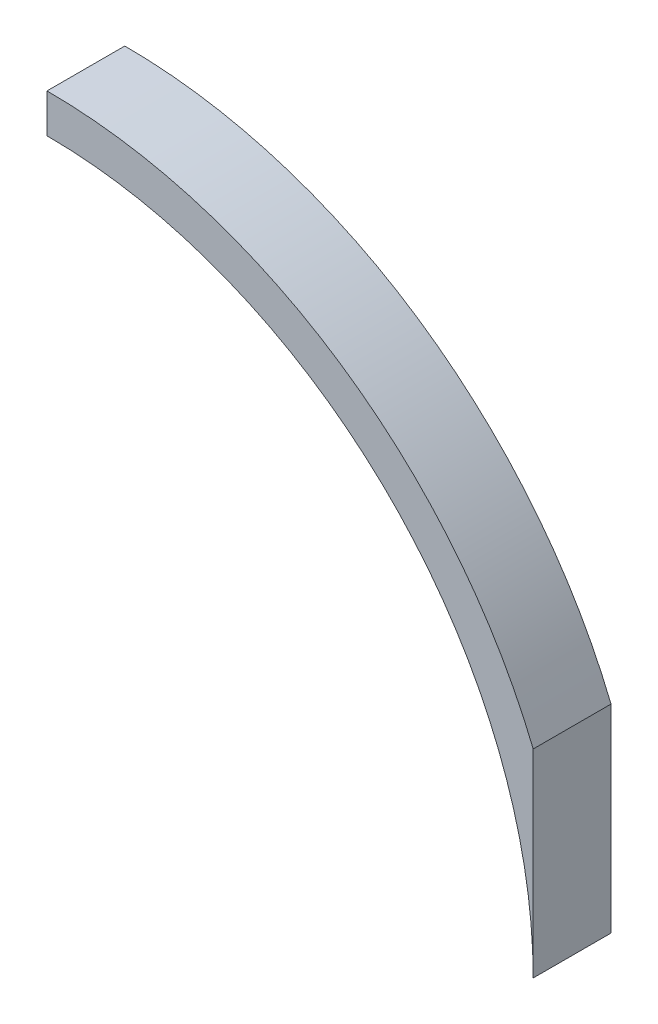
ISO-10303-21;
HEADER;
FILE_DESCRIPTION(('STEP AP214'),'2;1');
FILE_NAME('part.step','',(''),(''),'','','');
FILE_SCHEMA(('AUTOMOTIVE_DESIGN { 1 0 10303 214 1 1 1 1 }'));
ENDSEC;
DATA;
#1=APPLICATION_CONTEXT('core data for automotive mechanical design processes');
#2=APPLICATION_PROTOCOL_DEFINITION('international standard','automotive_design',2000,#1);
#3=PRODUCT_CONTEXT('',#1,'mechanical');
#4=PRODUCT('Part','Part','',(#3));
#5=PRODUCT_RELATED_PRODUCT_CATEGORY('part','',(#4));
#6=PRODUCT_DEFINITION_FORMATION('','',#4);
#7=PRODUCT_DEFINITION_CONTEXT('part definition',#1,'design');
#8=PRODUCT_DEFINITION('design','',#6,#7);
#9=PRODUCT_DEFINITION_SHAPE('','',#8);
#10=(LENGTH_UNIT() NAMED_UNIT(*) SI_UNIT(.MILLI.,.METRE.));
#11=(NAMED_UNIT(*) PLANE_ANGLE_UNIT() SI_UNIT($,.RADIAN.));
#12=(NAMED_UNIT(*) SI_UNIT($,.STERADIAN.) SOLID_ANGLE_UNIT());
#13=UNCERTAINTY_MEASURE_WITH_UNIT(LENGTH_MEASURE(1.E-05),#10,'distance_accuracy_value','');
#14=(GEOMETRIC_REPRESENTATION_CONTEXT(3) GLOBAL_UNCERTAINTY_ASSIGNED_CONTEXT((#13)) GLOBAL_UNIT_ASSIGNED_CONTEXT((#10,
#11,#12)) REPRESENTATION_CONTEXT('',''));
#15=CARTESIAN_POINT('',(0.,0.,0.));
#16=DIRECTION('',(0.,0.,1.));
#17=DIRECTION('',(1.,0.,0.));
#18=AXIS2_PLACEMENT_3D('',#15,#16,#17);
#19=CARTESIAN_POINT('',(0.,0.,20.));
#20=DIRECTION('',(0.,0.,-1.));
#21=DIRECTION('',(-1.,0.,0.));
#22=AXIS2_PLACEMENT_3D('',#19,#20,#21);
#23=CYLINDRICAL_SURFACE('',#22,125.);
#24=CARTESIAN_POINT('',(0.,0.,0.));
#25=DIRECTION('',(0.,0.,-1.));
#26=DIRECTION('',(1.,0.,0.));
#27=AXIS2_PLACEMENT_3D('',#24,#25,#26);
#28=CIRCLE('',#27,125.);
#29=CARTESIAN_POINT('',(3.65615931134792E-13,125.,0.));
#30=VERTEX_POINT('',#29);
#31=CARTESIAN_POINT('',(125.,0.,0.));
#32=VERTEX_POINT('',#31);
#33=EDGE_CURVE('E81',#30,#32,#28,.T.);
#34=ORIENTED_EDGE('',*,*,#33,.T.);
#35=DIRECTION('',(0.,0.,-1.));
#36=VECTOR('',#35,1.);
#37=CARTESIAN_POINT('',(125.,0.,20.));
#38=LINE('',#37,#36);
#39=CARTESIAN_POINT('',(125.,0.,20.));
#40=VERTEX_POINT('',#39);
#41=EDGE_CURVE('E41',#40,#32,#38,.T.);
#42=ORIENTED_EDGE('',*,*,#41,.F.);
#43=CARTESIAN_POINT('',(0.,0.,20.));
#44=DIRECTION('',(0.,0.,-1.));
#45=DIRECTION('',(1.,0.,0.));
#46=AXIS2_PLACEMENT_3D('',#43,#44,#45);
#47=CIRCLE('',#46,125.);
#48=CARTESIAN_POINT('',(3.65615931134792E-13,125.,20.));
#49=VERTEX_POINT('',#48);
#50=EDGE_CURVE('E76',#49,#40,#47,.T.);
#51=ORIENTED_EDGE('',*,*,#50,.F.);
#52=DIRECTION('',(0.,0.,-1.));
#53=VECTOR('',#52,1.);
#54=CARTESIAN_POINT('',(3.65615931134792E-13,125.,20.));
#55=LINE('',#54,#53);
#56=EDGE_CURVE('E71',#49,#30,#55,.T.);
#57=ORIENTED_EDGE('',*,*,#56,.T.);
#58=EDGE_LOOP('',(#34,#42,#51,#57));
#59=FACE_BOUND('',#58,.T.);
#60=ADVANCED_FACE('F33',(#59),#23,.F.);
#61=CARTESIAN_POINT('',(0.,0.,20.));
#62=DIRECTION('',(0.,0.,-1.));
#63=DIRECTION('',(-1.,0.,0.));
#64=AXIS2_PLACEMENT_3D('',#61,#62,#63);
#65=CYLINDRICAL_SURFACE('',#64,135.);
#66=CARTESIAN_POINT('',(0.,0.,20.));
#67=DIRECTION('',(0.,0.,1.));
#68=DIRECTION('',(1.,0.,0.));
#69=AXIS2_PLACEMENT_3D('',#66,#67,#68);
#70=CIRCLE('',#69,135.);
#71=CARTESIAN_POINT('',(125.,50.9901951359279,20.));
#72=VERTEX_POINT('',#71);
#73=CARTESIAN_POINT('',(3.97954647537675E-13,135.,20.));
#74=VERTEX_POINT('',#73);
#75=EDGE_CURVE('E104',#72,#74,#70,.T.);
#76=ORIENTED_EDGE('',*,*,#75,.F.);
#77=DIRECTION('',(0.,0.,-1.));
#78=VECTOR('',#77,1.);
#79=CARTESIAN_POINT('',(125.,50.9901951359279,20.));
#80=LINE('',#79,#78);
#81=CARTESIAN_POINT('',(125.,50.9901951359279,0.));
#82=VERTEX_POINT('',#81);
#83=EDGE_CURVE('E85',#72,#82,#80,.T.);
#84=ORIENTED_EDGE('',*,*,#83,.T.);
#85=CARTESIAN_POINT('',(0.,0.,0.));
#86=DIRECTION('',(0.,0.,1.));
#87=DIRECTION('',(1.,0.,0.));
#88=AXIS2_PLACEMENT_3D('',#85,#86,#87);
#89=CIRCLE('',#88,135.);
#90=CARTESIAN_POINT('',(3.97954647537675E-13,135.,0.));
#91=VERTEX_POINT('',#90);
#92=EDGE_CURVE('E63',#82,#91,#89,.T.);
#93=ORIENTED_EDGE('',*,*,#92,.T.);
#94=DIRECTION('',(0.,0.,-1.));
#95=VECTOR('',#94,1.);
#96=CARTESIAN_POINT('',(3.97954647537675E-13,135.,20.));
#97=LINE('',#96,#95);
#98=EDGE_CURVE('E73',#74,#91,#97,.T.);
#99=ORIENTED_EDGE('',*,*,#98,.F.);
#100=EDGE_LOOP('',(#76,#84,#93,#99));
#101=FACE_BOUND('',#100,.T.);
#102=ADVANCED_FACE('F106',(#101),#65,.T.);
#103=CARTESIAN_POINT('',(3.65615931134792E-13,125.,20.));
#104=DIRECTION('',(1.,0.,0.));
#105=DIRECTION('',(0.,1.,0.));
#106=AXIS2_PLACEMENT_3D('',#103,#104,#105);
#107=PLANE('',#106);
#108=DIRECTION('',(0.,-1.,0.));
#109=VECTOR('',#108,1.);
#110=CARTESIAN_POINT('',(3.65615931134792E-13,125.,0.));
#111=LINE('',#110,#109);
#112=EDGE_CURVE('E68',#91,#30,#111,.T.);
#113=ORIENTED_EDGE('',*,*,#112,.T.);
#114=ORIENTED_EDGE('',*,*,#56,.F.);
#115=DIRECTION('',(0.,-1.,0.));
#116=VECTOR('',#115,1.);
#117=CARTESIAN_POINT('',(3.65615931134792E-13,125.,20.));
#118=LINE('',#117,#116);
#119=EDGE_CURVE('E49',#74,#49,#118,.T.);
#120=ORIENTED_EDGE('',*,*,#119,.F.);
#121=ORIENTED_EDGE('',*,*,#98,.T.);
#122=EDGE_LOOP('',(#113,#114,#120,#121));
#123=FACE_BOUND('',#122,.T.);
#124=ADVANCED_FACE('F70',(#123),#107,.F.);
#125=CARTESIAN_POINT('',(0.,0.,20.));
#126=DIRECTION('',(0.,0.,1.));
#127=DIRECTION('',(1.,0.,0.));
#128=AXIS2_PLACEMENT_3D('',#125,#126,#127);
#129=PLANE('',#128);
#130=DIRECTION('',(0.,-1.,0.));
#131=VECTOR('',#130,1.);
#132=CARTESIAN_POINT('',(125.,0.,20.));
#133=LINE('',#132,#131);
#134=EDGE_CURVE('E88',#72,#40,#133,.T.);
#135=ORIENTED_EDGE('',*,*,#134,.F.);
#136=ORIENTED_EDGE('',*,*,#75,.T.);
#137=ORIENTED_EDGE('',*,*,#119,.T.);
#138=ORIENTED_EDGE('',*,*,#50,.T.);
#139=EDGE_LOOP('',(#135,#136,#137,#138));
#140=FACE_BOUND('',#139,.T.);
#141=ADVANCED_FACE('F103',(#140),#129,.T.);
#142=CARTESIAN_POINT('',(0.,0.,0.));
#143=DIRECTION('',(0.,0.,1.));
#144=DIRECTION('',(1.,0.,0.));
#145=AXIS2_PLACEMENT_3D('',#142,#143,#144);
#146=PLANE('',#145);
#147=ORIENTED_EDGE('',*,*,#92,.F.);
#148=DIRECTION('',(0.,-1.,0.));
#149=VECTOR('',#148,1.);
#150=CARTESIAN_POINT('',(125.,0.,0.));
#151=LINE('',#150,#149);
#152=EDGE_CURVE('E11',#82,#32,#151,.T.);
#153=ORIENTED_EDGE('',*,*,#152,.T.);
#154=ORIENTED_EDGE('',*,*,#33,.F.);
#155=ORIENTED_EDGE('',*,*,#112,.F.);
#156=EDGE_LOOP('',(#147,#153,#154,#155));
#157=FACE_BOUND('',#156,.T.);
#158=ADVANCED_FACE('F83',(#157),#146,.F.);
#159=CARTESIAN_POINT('',(125.,0.,0.));
#160=DIRECTION('',(-1.,0.,0.));
#161=DIRECTION('',(0.,0.,1.));
#162=AXIS2_PLACEMENT_3D('',#159,#160,#161);
#163=PLANE('',#162);
#164=ORIENTED_EDGE('',*,*,#134,.T.);
#165=ORIENTED_EDGE('',*,*,#41,.T.);
#166=ORIENTED_EDGE('',*,*,#152,.F.);
#167=ORIENTED_EDGE('',*,*,#83,.F.);
#168=EDGE_LOOP('',(#164,#165,#166,#167));
#169=FACE_BOUND('',#168,.T.);
#170=ADVANCED_FACE('F95',(#169),#163,.F.);
#171=CLOSED_SHELL('',(#60,#102,#124,#141,#158,#170));
#172=MANIFOLD_SOLID_BREP('B2',#171);
#173=ADVANCED_BREP_SHAPE_REPRESENTATION('',(#18,#172),#14);
#174=SHAPE_DEFINITION_REPRESENTATION(#9,#173);
ENDSEC;
END-ISO-10303-21;
